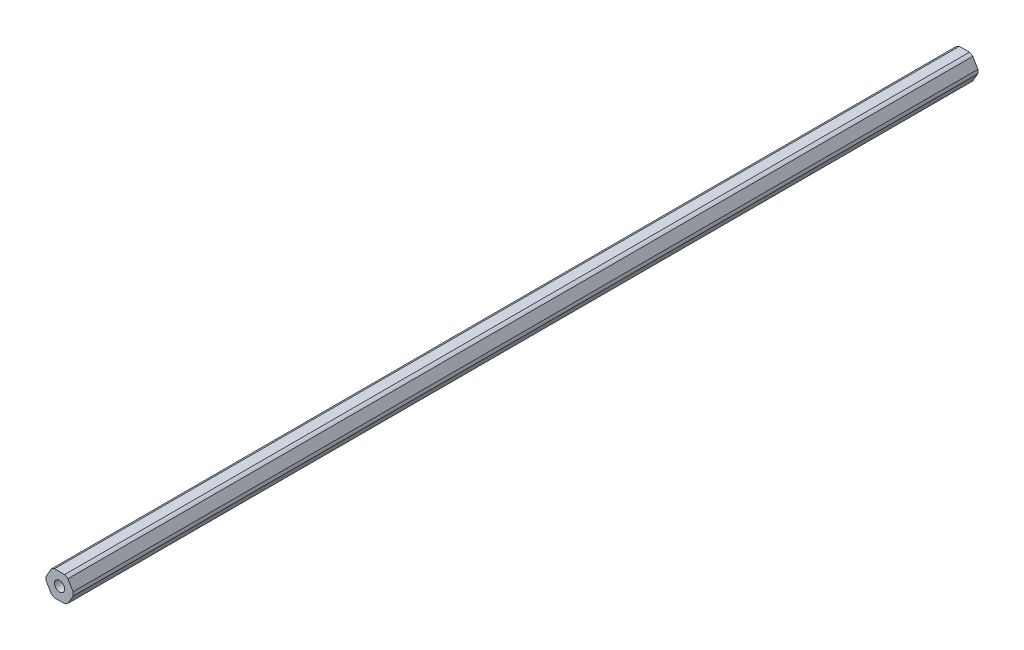
ISO-10303-21;
HEADER;
FILE_DESCRIPTION(('STEP AP214'),'2;1');
FILE_NAME('part.step','',(''),(''),'','','');
FILE_SCHEMA(('AUTOMOTIVE_DESIGN { 1 0 10303 214 1 1 1 1 }'));
ENDSEC;
DATA;
#1=APPLICATION_CONTEXT('core data for automotive mechanical design processes');
#2=APPLICATION_PROTOCOL_DEFINITION('international standard','automotive_design',2000,#1);
#3=PRODUCT_CONTEXT('',#1,'mechanical');
#4=PRODUCT('Part','Part','',(#3));
#5=PRODUCT_RELATED_PRODUCT_CATEGORY('part','',(#4));
#6=PRODUCT_DEFINITION_FORMATION('','',#4);
#7=PRODUCT_DEFINITION_CONTEXT('part definition',#1,'design');
#8=PRODUCT_DEFINITION('design','',#6,#7);
#9=PRODUCT_DEFINITION_SHAPE('','',#8);
#10=(LENGTH_UNIT() NAMED_UNIT(*) SI_UNIT(.MILLI.,.METRE.));
#11=(NAMED_UNIT(*) PLANE_ANGLE_UNIT() SI_UNIT($,.RADIAN.));
#12=(NAMED_UNIT(*) SI_UNIT($,.STERADIAN.) SOLID_ANGLE_UNIT());
#13=UNCERTAINTY_MEASURE_WITH_UNIT(LENGTH_MEASURE(1.E-05),#10,'distance_accuracy_value','');
#14=(GEOMETRIC_REPRESENTATION_CONTEXT(3) GLOBAL_UNCERTAINTY_ASSIGNED_CONTEXT((#13)) GLOBAL_UNIT_ASSIGNED_CONTEXT((#10,
#11,#12)) REPRESENTATION_CONTEXT('',''));
#15=CARTESIAN_POINT('',(0.,0.,0.));
#16=DIRECTION('',(0.,0.,1.));
#17=DIRECTION('',(1.,0.,0.));
#18=AXIS2_PLACEMENT_3D('',#15,#16,#17);
#19=CARTESIAN_POINT('',(0.,0.,-228.6));
#20=DIRECTION('',(0.,0.,1.));
#21=DIRECTION('',(1.,0.,0.));
#22=AXIS2_PLACEMENT_3D('',#19,#20,#21);
#23=CYLINDRICAL_SURFACE('',#22,6.87);
#24=DIRECTION('',(0.,0.,1.));
#25=VECTOR('',#24,1.);
#26=CARTESIAN_POINT('',(6.80102150534208,0.97108520937895,228.6));
#27=LINE('',#26,#25);
#28=CARTESIAN_POINT('',(6.80102150534208,0.971085209378948,-228.6));
#29=VERTEX_POINT('',#28);
#30=CARTESIAN_POINT('',(6.80102150534208,0.971085209378948,228.6));
#31=VERTEX_POINT('',#30);
#32=EDGE_CURVE('E109',#29,#31,#27,.T.);
#33=ORIENTED_EDGE('',*,*,#32,.T.);
#34=CARTESIAN_POINT('',(0.,0.,228.6));
#35=DIRECTION('',(0.,0.,1.));
#36=DIRECTION('',(1.,0.,0.));
#37=AXIS2_PLACEMENT_3D('',#34,#35,#36);
#38=CIRCLE('',#37,6.87);
#39=CARTESIAN_POINT('',(6.80102150534208,-0.971085209378954,228.6));
#40=VERTEX_POINT('',#39);
#41=EDGE_CURVE('E104',#31,#40,#38,.F.);
#42=ORIENTED_EDGE('',*,*,#41,.T.);
#43=DIRECTION('',(0.,0.,1.));
#44=VECTOR('',#43,1.);
#45=CARTESIAN_POINT('',(6.80102150534208,-0.971085209378955,228.6));
#46=LINE('',#45,#44);
#47=CARTESIAN_POINT('',(6.80102150534208,-0.971085209378953,-228.6));
#48=VERTEX_POINT('',#47);
#49=EDGE_CURVE('E106',#40,#48,#46,.F.);
#50=ORIENTED_EDGE('',*,*,#49,.T.);
#51=CARTESIAN_POINT('',(0.,0.,-228.6));
#52=DIRECTION('',(0.,0.,1.));
#53=DIRECTION('',(1.,0.,0.));
#54=AXIS2_PLACEMENT_3D('',#51,#52,#53);
#55=CIRCLE('',#54,6.87);
#56=EDGE_CURVE('E20',#48,#29,#55,.T.);
#57=ORIENTED_EDGE('',*,*,#56,.T.);
#58=EDGE_LOOP('',(#33,#42,#50,#57));
#59=FACE_BOUND('',#58,.T.);
#60=ADVANCED_FACE('F17',(#59),#23,.T.);
#61=CARTESIAN_POINT('',(3.68083890619154,6.3754,228.6));
#62=DIRECTION('',(0.,-1.,0.));
#63=DIRECTION('',(1.,0.,0.));
#64=AXIS2_PLACEMENT_3D('',#61,#62,#63);
#65=PLANE('',#64);
#66=DIRECTION('',(1.,0.,0.));
#67=VECTOR('',#66,1.);
#68=CARTESIAN_POINT('',(0.,6.3754,-228.6));
#69=LINE('',#68,#67);
#70=CARTESIAN_POINT('',(2.55952629210953,6.37540000000001,-228.6));
#71=VERTEX_POINT('',#70);
#72=CARTESIAN_POINT('',(-2.55952629210953,6.37540000000001,-228.6));
#73=VERTEX_POINT('',#72);
#74=EDGE_CURVE('E128',#71,#73,#69,.F.);
#75=ORIENTED_EDGE('',*,*,#74,.T.);
#76=DIRECTION('',(0.,0.,1.));
#77=VECTOR('',#76,1.);
#78=CARTESIAN_POINT('',(-2.55952629210953,6.37540000000001,-228.6));
#79=LINE('',#78,#77);
#80=CARTESIAN_POINT('',(-2.55952629210953,6.37540000000001,228.6));
#81=VERTEX_POINT('',#80);
#82=EDGE_CURVE('E113',#81,#73,#79,.F.);
#83=ORIENTED_EDGE('',*,*,#82,.F.);
#84=DIRECTION('',(1.,0.,0.));
#85=VECTOR('',#84,1.);
#86=CARTESIAN_POINT('',(0.,6.3754,228.6));
#87=LINE('',#86,#85);
#88=CARTESIAN_POINT('',(2.55952629210953,6.37540000000001,228.6));
#89=VERTEX_POINT('',#88);
#90=EDGE_CURVE('E145',#89,#81,#87,.F.);
#91=ORIENTED_EDGE('',*,*,#90,.F.);
#92=DIRECTION('',(0.,0.,1.));
#93=VECTOR('',#92,1.);
#94=CARTESIAN_POINT('',(2.55952629210953,6.37540000000001,-228.6));
#95=LINE('',#94,#93);
#96=EDGE_CURVE('E150',#71,#89,#95,.T.);
#97=ORIENTED_EDGE('',*,*,#96,.F.);
#98=EDGE_LOOP('',(#75,#83,#91,#97));
#99=FACE_BOUND('',#98,.T.);
#100=ADVANCED_FACE('F197',(#99),#65,.F.);
#101=CARTESIAN_POINT('',(0.,0.,-228.6));
#102=DIRECTION('',(0.,0.,1.));
#103=DIRECTION('',(1.,0.,0.));
#104=AXIS2_PLACEMENT_3D('',#101,#102,#103);
#105=CYLINDRICAL_SURFACE('',#104,6.87);
#106=DIRECTION('',(0.,0.,1.));
#107=VECTOR('',#106,1.);
#108=CARTESIAN_POINT('',(-4.24149521323255,5.40431479062104,228.6));
#109=LINE('',#108,#107);
#110=CARTESIAN_POINT('',(-4.24149521323255,5.40431479062105,-228.6));
#111=VERTEX_POINT('',#110);
#112=CARTESIAN_POINT('',(-4.24149521323255,5.40431479062105,228.6));
#113=VERTEX_POINT('',#112);
#114=EDGE_CURVE('E166',#111,#113,#109,.T.);
#115=ORIENTED_EDGE('',*,*,#114,.T.);
#116=CARTESIAN_POINT('',(0.,0.,228.6));
#117=DIRECTION('',(0.,0.,1.));
#118=DIRECTION('',(1.,0.,0.));
#119=AXIS2_PLACEMENT_3D('',#116,#117,#118);
#120=CIRCLE('',#119,6.87);
#121=EDGE_CURVE('E144',#81,#113,#120,.T.);
#122=ORIENTED_EDGE('',*,*,#121,.F.);
#123=ORIENTED_EDGE('',*,*,#82,.T.);
#124=CARTESIAN_POINT('',(0.,0.,-228.6));
#125=DIRECTION('',(0.,0.,1.));
#126=DIRECTION('',(1.,0.,0.));
#127=AXIS2_PLACEMENT_3D('',#124,#125,#126);
#128=CIRCLE('',#127,6.87);
#129=EDGE_CURVE('E131',#73,#111,#128,.T.);
#130=ORIENTED_EDGE('',*,*,#129,.T.);
#131=EDGE_LOOP('',(#115,#122,#123,#130));
#132=FACE_BOUND('',#131,.T.);
#133=ADVANCED_FACE('F201',(#132),#105,.T.);
#134=CARTESIAN_POINT('',(-3.68083890619154,6.3754,228.6));
#135=DIRECTION('',(0.866025403784439,-0.5,0.));
#136=DIRECTION('',(0.5,0.866025403784439,0.));
#137=AXIS2_PLACEMENT_3D('',#134,#135,#136);
#138=PLANE('',#137);
#139=DIRECTION('',(-0.5,-0.866025403784439,0.));
#140=VECTOR('',#139,1.);
#141=CARTESIAN_POINT('',(-4.24149521323255,5.40431479062104,-228.6));
#142=LINE('',#141,#140);
#143=CARTESIAN_POINT('',(-6.80102150534208,0.971085209378961,-228.6));
#144=VERTEX_POINT('',#143);
#145=EDGE_CURVE('E186',#111,#144,#142,.T.);
#146=ORIENTED_EDGE('',*,*,#145,.T.);
#147=DIRECTION('',(0.,0.,1.));
#148=VECTOR('',#147,1.);
#149=CARTESIAN_POINT('',(-6.80102150534208,0.971085209378959,-228.6));
#150=LINE('',#149,#148);
#151=CARTESIAN_POINT('',(-6.80102150534208,0.971085209378961,228.6));
#152=VERTEX_POINT('',#151);
#153=EDGE_CURVE('E164',#152,#144,#150,.F.);
#154=ORIENTED_EDGE('',*,*,#153,.F.);
#155=DIRECTION('',(-0.5,-0.866025403784439,0.));
#156=VECTOR('',#155,1.);
#157=CARTESIAN_POINT('',(-4.24149521323255,5.40431479062104,228.6));
#158=LINE('',#157,#156);
#159=EDGE_CURVE('E142',#113,#152,#158,.T.);
#160=ORIENTED_EDGE('',*,*,#159,.F.);
#161=ORIENTED_EDGE('',*,*,#114,.F.);
#162=EDGE_LOOP('',(#146,#154,#160,#161));
#163=FACE_BOUND('',#162,.T.);
#164=ADVANCED_FACE('F207',(#163),#138,.F.);
#165=CARTESIAN_POINT('',(0.,0.,-228.6));
#166=DIRECTION('',(0.,0.,1.));
#167=DIRECTION('',(1.,0.,0.));
#168=AXIS2_PLACEMENT_3D('',#165,#166,#167);
#169=CYLINDRICAL_SURFACE('',#168,6.87);
#170=DIRECTION('',(0.,0.,1.));
#171=VECTOR('',#170,1.);
#172=CARTESIAN_POINT('',(-6.80102150534208,-0.971085209378956,228.6));
#173=LINE('',#172,#171);
#174=CARTESIAN_POINT('',(-6.80102150534208,-0.971085209378956,-228.6));
#175=VERTEX_POINT('',#174);
#176=CARTESIAN_POINT('',(-6.80102150534208,-0.971085209378955,228.6));
#177=VERTEX_POINT('',#176);
#178=EDGE_CURVE('E161',#175,#177,#173,.T.);
#179=ORIENTED_EDGE('',*,*,#178,.T.);
#180=CARTESIAN_POINT('',(0.,0.,228.6));
#181=DIRECTION('',(0.,0.,1.));
#182=DIRECTION('',(1.,0.,0.));
#183=AXIS2_PLACEMENT_3D('',#180,#181,#182);
#184=CIRCLE('',#183,6.87);
#185=EDGE_CURVE('E141',#152,#177,#184,.T.);
#186=ORIENTED_EDGE('',*,*,#185,.F.);
#187=ORIENTED_EDGE('',*,*,#153,.T.);
#188=CARTESIAN_POINT('',(0.,0.,-228.6));
#189=DIRECTION('',(0.,0.,1.));
#190=DIRECTION('',(1.,0.,0.));
#191=AXIS2_PLACEMENT_3D('',#188,#189,#190);
#192=CIRCLE('',#191,6.87);
#193=EDGE_CURVE('E183',#144,#175,#192,.T.);
#194=ORIENTED_EDGE('',*,*,#193,.T.);
#195=EDGE_LOOP('',(#179,#186,#187,#194));
#196=FACE_BOUND('',#195,.T.);
#197=ADVANCED_FACE('F211',(#196),#169,.T.);
#198=CARTESIAN_POINT('',(-7.36167781238308,0.,228.6));
#199=DIRECTION('',(0.866025403784439,0.5,0.));
#200=DIRECTION('',(-0.5,0.866025403784439,0.));
#201=AXIS2_PLACEMENT_3D('',#198,#199,#200);
#202=PLANE('',#201);
#203=DIRECTION('',(0.5,-0.866025403784438,0.));
#204=VECTOR('',#203,1.);
#205=CARTESIAN_POINT('',(-6.80102150534208,-0.971085209378956,-228.6));
#206=LINE('',#205,#204);
#207=CARTESIAN_POINT('',(-4.24149521323254,-5.40431479062105,-228.6));
#208=VERTEX_POINT('',#207);
#209=EDGE_CURVE('E182',#175,#208,#206,.T.);
#210=ORIENTED_EDGE('',*,*,#209,.T.);
#211=DIRECTION('',(0.,0.,1.));
#212=VECTOR('',#211,1.);
#213=CARTESIAN_POINT('',(-4.24149521323255,-5.40431479062105,-228.6));
#214=LINE('',#213,#212);
#215=CARTESIAN_POINT('',(-4.24149521323255,-5.40431479062105,228.6));
#216=VERTEX_POINT('',#215);
#217=EDGE_CURVE('E159',#216,#208,#214,.F.);
#218=ORIENTED_EDGE('',*,*,#217,.F.);
#219=DIRECTION('',(0.5,-0.866025403784439,0.));
#220=VECTOR('',#219,1.);
#221=CARTESIAN_POINT('',(-6.80102150534208,-0.971085209378956,228.6));
#222=LINE('',#221,#220);
#223=EDGE_CURVE('E139',#177,#216,#222,.T.);
#224=ORIENTED_EDGE('',*,*,#223,.F.);
#225=ORIENTED_EDGE('',*,*,#178,.F.);
#226=EDGE_LOOP('',(#210,#218,#224,#225));
#227=FACE_BOUND('',#226,.T.);
#228=ADVANCED_FACE('F217',(#227),#202,.F.);
#229=CARTESIAN_POINT('',(0.,0.,-228.6));
#230=DIRECTION('',(0.,0.,1.));
#231=DIRECTION('',(1.,0.,0.));
#232=AXIS2_PLACEMENT_3D('',#229,#230,#231);
#233=CYLINDRICAL_SURFACE('',#232,6.87);
#234=DIRECTION('',(0.,0.,1.));
#235=VECTOR('',#234,1.);
#236=CARTESIAN_POINT('',(-2.55952629210953,-6.3754,228.6));
#237=LINE('',#236,#235);
#238=CARTESIAN_POINT('',(-2.55952629210953,-6.3754,-228.6));
#239=VERTEX_POINT('',#238);
#240=CARTESIAN_POINT('',(-2.55952629210953,-6.3754,228.6));
#241=VERTEX_POINT('',#240);
#242=EDGE_CURVE('E156',#239,#241,#237,.T.);
#243=ORIENTED_EDGE('',*,*,#242,.T.);
#244=CARTESIAN_POINT('',(0.,0.,228.6));
#245=DIRECTION('',(0.,0.,1.));
#246=DIRECTION('',(1.,0.,0.));
#247=AXIS2_PLACEMENT_3D('',#244,#245,#246);
#248=CIRCLE('',#247,6.87);
#249=EDGE_CURVE('E138',#216,#241,#248,.T.);
#250=ORIENTED_EDGE('',*,*,#249,.F.);
#251=ORIENTED_EDGE('',*,*,#217,.T.);
#252=CARTESIAN_POINT('',(0.,0.,-228.6));
#253=DIRECTION('',(0.,0.,1.));
#254=DIRECTION('',(1.,0.,0.));
#255=AXIS2_PLACEMENT_3D('',#252,#253,#254);
#256=CIRCLE('',#255,6.87);
#257=EDGE_CURVE('E179',#208,#239,#256,.T.);
#258=ORIENTED_EDGE('',*,*,#257,.T.);
#259=EDGE_LOOP('',(#243,#250,#251,#258));
#260=FACE_BOUND('',#259,.T.);
#261=ADVANCED_FACE('F222',(#260),#233,.T.);
#262=CARTESIAN_POINT('',(-3.68083890619154,-6.3754,228.6));
#263=DIRECTION('',(0.,1.,0.));
#264=DIRECTION('',(0.,0.,1.));
#265=AXIS2_PLACEMENT_3D('',#262,#263,#264);
#266=PLANE('',#265);
#267=DIRECTION('',(1.,0.,0.));
#268=VECTOR('',#267,1.);
#269=CARTESIAN_POINT('',(0.,-6.3754,-228.6));
#270=LINE('',#269,#268);
#271=CARTESIAN_POINT('',(2.55952629210953,-6.3754,-228.6));
#272=VERTEX_POINT('',#271);
#273=EDGE_CURVE('E178',#239,#272,#270,.T.);
#274=ORIENTED_EDGE('',*,*,#273,.T.);
#275=DIRECTION('',(0.,0.,1.));
#276=VECTOR('',#275,1.);
#277=CARTESIAN_POINT('',(2.55952629210953,-6.3754,-228.6));
#278=LINE('',#277,#276);
#279=CARTESIAN_POINT('',(2.55952629210953,-6.3754,228.6));
#280=VERTEX_POINT('',#279);
#281=EDGE_CURVE('E121',#280,#272,#278,.F.);
#282=ORIENTED_EDGE('',*,*,#281,.F.);
#283=DIRECTION('',(1.,0.,0.));
#284=VECTOR('',#283,1.);
#285=CARTESIAN_POINT('',(0.,-6.3754,228.6));
#286=LINE('',#285,#284);
#287=EDGE_CURVE('E133',#241,#280,#286,.T.);
#288=ORIENTED_EDGE('',*,*,#287,.F.);
#289=ORIENTED_EDGE('',*,*,#242,.F.);
#290=EDGE_LOOP('',(#274,#282,#288,#289));
#291=FACE_BOUND('',#290,.T.);
#292=ADVANCED_FACE('F227',(#291),#266,.F.);
#293=CARTESIAN_POINT('',(0.,0.,-228.6));
#294=DIRECTION('',(0.,0.,1.));
#295=DIRECTION('',(1.,0.,0.));
#296=AXIS2_PLACEMENT_3D('',#293,#294,#295);
#297=CYLINDRICAL_SURFACE('',#296,6.87);
#298=ORIENTED_EDGE('',*,*,#281,.T.);
#299=CARTESIAN_POINT('',(0.,0.,-228.6));
#300=DIRECTION('',(0.,0.,1.));
#301=DIRECTION('',(1.,0.,0.));
#302=AXIS2_PLACEMENT_3D('',#299,#300,#301);
#303=CIRCLE('',#302,6.87);
#304=CARTESIAN_POINT('',(4.24149521323254,-5.40431479062105,-228.6));
#305=VERTEX_POINT('',#304);
#306=EDGE_CURVE('E175',#272,#305,#303,.T.);
#307=ORIENTED_EDGE('',*,*,#306,.T.);
#308=DIRECTION('',(0.,0.,1.));
#309=VECTOR('',#308,1.);
#310=CARTESIAN_POINT('',(4.24149521323254,-5.40431479062105,228.6));
#311=LINE('',#310,#309);
#312=CARTESIAN_POINT('',(4.24149521323254,-5.40431479062105,228.6));
#313=VERTEX_POINT('',#312);
#314=EDGE_CURVE('E120',#305,#313,#311,.T.);
#315=ORIENTED_EDGE('',*,*,#314,.T.);
#316=CARTESIAN_POINT('',(0.,0.,228.6));
#317=DIRECTION('',(0.,0.,1.));
#318=DIRECTION('',(1.,0.,0.));
#319=AXIS2_PLACEMENT_3D('',#316,#317,#318);
#320=CIRCLE('',#319,6.87);
#321=EDGE_CURVE('E126',#280,#313,#320,.T.);
#322=ORIENTED_EDGE('',*,*,#321,.F.);
#323=EDGE_LOOP('',(#298,#307,#315,#322));
#324=FACE_BOUND('',#323,.T.);
#325=ADVANCED_FACE('F230',(#324),#297,.T.);
#326=CARTESIAN_POINT('',(3.68083890619154,-6.3754,228.6));
#327=DIRECTION('',(-0.866025403784439,0.5,0.));
#328=DIRECTION('',(-0.5,-0.866025403784439,0.));
#329=AXIS2_PLACEMENT_3D('',#326,#327,#328);
#330=PLANE('',#329);
#331=DIRECTION('',(0.5,0.866025403784439,0.));
#332=VECTOR('',#331,1.);
#333=CARTESIAN_POINT('',(4.24149521323254,-5.40431479062105,-228.6));
#334=LINE('',#333,#332);
#335=EDGE_CURVE('E119',#305,#48,#334,.T.);
#336=ORIENTED_EDGE('',*,*,#335,.T.);
#337=ORIENTED_EDGE('',*,*,#49,.F.);
#338=DIRECTION('',(0.5,0.866025403784439,0.));
#339=VECTOR('',#338,1.);
#340=CARTESIAN_POINT('',(4.24149521323254,-5.40431479062105,228.6));
#341=LINE('',#340,#339);
#342=EDGE_CURVE('E117',#313,#40,#341,.T.);
#343=ORIENTED_EDGE('',*,*,#342,.F.);
#344=ORIENTED_EDGE('',*,*,#314,.F.);
#345=EDGE_LOOP('',(#336,#337,#343,#344));
#346=FACE_BOUND('',#345,.T.);
#347=ADVANCED_FACE('F116',(#346),#330,.F.);
#348=CARTESIAN_POINT('',(7.36167781238308,0.,228.6));
#349=DIRECTION('',(-0.866025403784439,-0.5,0.));
#350=DIRECTION('',(0.5,-0.866025403784439,0.));
#351=AXIS2_PLACEMENT_3D('',#348,#349,#350);
#352=PLANE('',#351);
#353=DIRECTION('',(-0.5,0.866025403784438,0.));
#354=VECTOR('',#353,1.);
#355=CARTESIAN_POINT('',(6.80102150534208,0.97108520937895,-228.6));
#356=LINE('',#355,#354);
#357=CARTESIAN_POINT('',(4.24149521323254,5.40431479062105,-228.6));
#358=VERTEX_POINT('',#357);
#359=EDGE_CURVE('E174',#29,#358,#356,.T.);
#360=ORIENTED_EDGE('',*,*,#359,.T.);
#361=DIRECTION('',(0.,0.,1.));
#362=VECTOR('',#361,1.);
#363=CARTESIAN_POINT('',(4.24149521323254,5.40431479062105,-228.6));
#364=LINE('',#363,#362);
#365=CARTESIAN_POINT('',(4.24149521323254,5.40431479062105,228.6));
#366=VERTEX_POINT('',#365);
#367=EDGE_CURVE('E35',#366,#358,#364,.F.);
#368=ORIENTED_EDGE('',*,*,#367,.F.);
#369=DIRECTION('',(-0.5,0.866025403784438,0.));
#370=VECTOR('',#369,1.);
#371=CARTESIAN_POINT('',(6.80102150534208,0.97108520937895,228.6));
#372=LINE('',#371,#370);
#373=EDGE_CURVE('E148',#31,#366,#372,.T.);
#374=ORIENTED_EDGE('',*,*,#373,.F.);
#375=ORIENTED_EDGE('',*,*,#32,.F.);
#376=EDGE_LOOP('',(#360,#368,#374,#375));
#377=FACE_BOUND('',#376,.T.);
#378=ADVANCED_FACE('F242',(#377),#352,.F.);
#379=CARTESIAN_POINT('',(0.,0.,-228.6));
#380=DIRECTION('',(0.,0.,1.));
#381=DIRECTION('',(1.,0.,0.));
#382=AXIS2_PLACEMENT_3D('',#379,#380,#381);
#383=CYLINDRICAL_SURFACE('',#382,6.87);
#384=ORIENTED_EDGE('',*,*,#96,.T.);
#385=CARTESIAN_POINT('',(0.,0.,228.6));
#386=DIRECTION('',(0.,0.,1.));
#387=DIRECTION('',(1.,0.,0.));
#388=AXIS2_PLACEMENT_3D('',#385,#386,#387);
#389=CIRCLE('',#388,6.87);
#390=EDGE_CURVE('E147',#366,#89,#389,.T.);
#391=ORIENTED_EDGE('',*,*,#390,.F.);
#392=ORIENTED_EDGE('',*,*,#367,.T.);
#393=CARTESIAN_POINT('',(0.,0.,-228.6));
#394=DIRECTION('',(0.,0.,1.));
#395=DIRECTION('',(1.,0.,0.));
#396=AXIS2_PLACEMENT_3D('',#393,#394,#395);
#397=CIRCLE('',#396,6.87);
#398=EDGE_CURVE('E172',#358,#71,#397,.T.);
#399=ORIENTED_EDGE('',*,*,#398,.T.);
#400=EDGE_LOOP('',(#384,#391,#392,#399));
#401=FACE_BOUND('',#400,.T.);
#402=ADVANCED_FACE('F244',(#401),#383,.T.);
#403=CARTESIAN_POINT('',(0.,0.,228.6));
#404=DIRECTION('',(0.,0.,1.));
#405=DIRECTION('',(1.,0.,0.));
#406=AXIS2_PLACEMENT_3D('',#403,#404,#405);
#407=PLANE('',#406);
#408=ORIENTED_EDGE('',*,*,#342,.T.);
#409=ORIENTED_EDGE('',*,*,#41,.F.);
#410=ORIENTED_EDGE('',*,*,#373,.T.);
#411=ORIENTED_EDGE('',*,*,#390,.T.);
#412=ORIENTED_EDGE('',*,*,#90,.T.);
#413=ORIENTED_EDGE('',*,*,#121,.T.);
#414=ORIENTED_EDGE('',*,*,#159,.T.);
#415=ORIENTED_EDGE('',*,*,#185,.T.);
#416=ORIENTED_EDGE('',*,*,#223,.T.);
#417=ORIENTED_EDGE('',*,*,#249,.T.);
#418=ORIENTED_EDGE('',*,*,#287,.T.);
#419=ORIENTED_EDGE('',*,*,#321,.T.);
#420=EDGE_LOOP('',(#408,#409,#410,#411,#412,#413,#414,#415,#416,#417,#418,#419));
#421=FACE_BOUND('',#420,.T.);
#422=CARTESIAN_POINT('',(0.,0.,228.6));
#423=DIRECTION('',(0.,0.,1.));
#424=DIRECTION('',(1.,0.,0.));
#425=AXIS2_PLACEMENT_3D('',#422,#423,#424);
#426=CIRCLE('',#425,2.55);
#427=CARTESIAN_POINT('',(2.55,0.,228.6));
#428=VERTEX_POINT('',#427);
#429=EDGE_CURVE('E26',#428,#428,#426,.F.);
#430=ORIENTED_EDGE('',*,*,#429,.T.);
#431=EDGE_LOOP('',(#430));
#432=FACE_BOUND('',#431,.T.);
#433=ADVANCED_FACE('F123',(#421,#432),#407,.T.);
#434=CARTESIAN_POINT('',(0.,0.,-228.6));
#435=DIRECTION('',(0.,0.,1.));
#436=DIRECTION('',(1.,0.,0.));
#437=AXIS2_PLACEMENT_3D('',#434,#435,#436);
#438=PLANE('',#437);
#439=ORIENTED_EDGE('',*,*,#359,.F.);
#440=ORIENTED_EDGE('',*,*,#56,.F.);
#441=ORIENTED_EDGE('',*,*,#335,.F.);
#442=ORIENTED_EDGE('',*,*,#306,.F.);
#443=ORIENTED_EDGE('',*,*,#273,.F.);
#444=ORIENTED_EDGE('',*,*,#257,.F.);
#445=ORIENTED_EDGE('',*,*,#209,.F.);
#446=ORIENTED_EDGE('',*,*,#193,.F.);
#447=ORIENTED_EDGE('',*,*,#145,.F.);
#448=ORIENTED_EDGE('',*,*,#129,.F.);
#449=ORIENTED_EDGE('',*,*,#74,.F.);
#450=ORIENTED_EDGE('',*,*,#398,.F.);
#451=EDGE_LOOP('',(#439,#440,#441,#442,#443,#444,#445,#446,#447,#448,#449,#450));
#452=FACE_BOUND('',#451,.T.);
#453=CARTESIAN_POINT('',(0.,0.,-228.6));
#454=DIRECTION('',(0.,0.,1.));
#455=DIRECTION('',(1.,0.,0.));
#456=AXIS2_PLACEMENT_3D('',#453,#454,#455);
#457=CIRCLE('',#456,2.55);
#458=CARTESIAN_POINT('',(2.55,0.,-228.6));
#459=VERTEX_POINT('',#458);
#460=EDGE_CURVE('E10',#459,#459,#457,.T.);
#461=ORIENTED_EDGE('',*,*,#460,.T.);
#462=EDGE_LOOP('',(#461));
#463=FACE_BOUND('',#462,.T.);
#464=ADVANCED_FACE('F234',(#452,#463),#438,.F.);
#465=CARTESIAN_POINT('',(0.,0.,-228.6));
#466=DIRECTION('',(0.,0.,1.));
#467=DIRECTION('',(1.,0.,0.));
#468=AXIS2_PLACEMENT_3D('',#465,#466,#467);
#469=CYLINDRICAL_SURFACE('',#468,2.55);
#470=ORIENTED_EDGE('',*,*,#429,.F.);
#471=EDGE_LOOP('',(#470));
#472=FACE_BOUND('',#471,.T.);
#473=ORIENTED_EDGE('',*,*,#460,.F.);
#474=EDGE_LOOP('',(#473));
#475=FACE_BOUND('',#474,.T.);
#476=ADVANCED_FACE('F253',(#472,#475),#469,.F.);
#477=CLOSED_SHELL('',(#60,#100,#133,#164,#197,#228,#261,#292,#325,#347,#378,#402,#433,#464,#476));
#478=MANIFOLD_SOLID_BREP('B1',#477);
#479=ADVANCED_BREP_SHAPE_REPRESENTATION('',(#18,#478),#14);
#480=SHAPE_DEFINITION_REPRESENTATION(#9,#479);
ENDSEC;
END-ISO-10303-21;
